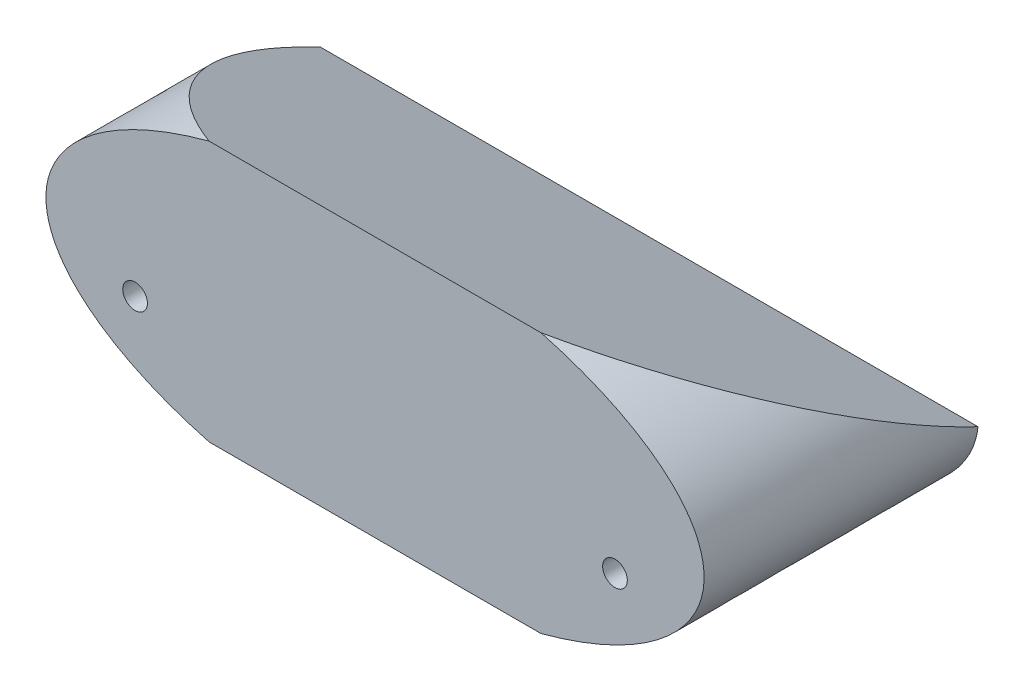
ISO-10303-21;
HEADER;
FILE_DESCRIPTION(('STEP AP214'),'2;1');
FILE_NAME('part.step','',(''),(''),'','','');
FILE_SCHEMA(('AUTOMOTIVE_DESIGN { 1 0 10303 214 1 1 1 1 }'));
ENDSEC;
DATA;
#1=APPLICATION_CONTEXT('core data for automotive mechanical design processes');
#2=APPLICATION_PROTOCOL_DEFINITION('international standard','automotive_design',2000,#1);
#3=PRODUCT_CONTEXT('',#1,'mechanical');
#4=PRODUCT('Part','Part','',(#3));
#5=PRODUCT_RELATED_PRODUCT_CATEGORY('part','',(#4));
#6=PRODUCT_DEFINITION_FORMATION('','',#4);
#7=PRODUCT_DEFINITION_CONTEXT('part definition',#1,'design');
#8=PRODUCT_DEFINITION('design','',#6,#7);
#9=PRODUCT_DEFINITION_SHAPE('','',#8);
#10=(LENGTH_UNIT() NAMED_UNIT(*) SI_UNIT(.MILLI.,.METRE.));
#11=(NAMED_UNIT(*) PLANE_ANGLE_UNIT() SI_UNIT($,.RADIAN.));
#12=(NAMED_UNIT(*) SI_UNIT($,.STERADIAN.) SOLID_ANGLE_UNIT());
#13=UNCERTAINTY_MEASURE_WITH_UNIT(LENGTH_MEASURE(1.E-05),#10,'distance_accuracy_value','');
#14=(GEOMETRIC_REPRESENTATION_CONTEXT(3) GLOBAL_UNCERTAINTY_ASSIGNED_CONTEXT((#13)) GLOBAL_UNIT_ASSIGNED_CONTEXT((#10,
#11,#12)) REPRESENTATION_CONTEXT('',''));
#15=CARTESIAN_POINT('',(0.,0.,0.));
#16=DIRECTION('',(0.,0.,1.));
#17=DIRECTION('',(1.,0.,0.));
#18=AXIS2_PLACEMENT_3D('',#15,#16,#17);
#19=CARTESIAN_POINT('',(0.,0.,-200.));
#20=DIRECTION('',(0.,0.,1.));
#21=DIRECTION('',(1.,0.,0.));
#22=AXIS2_PLACEMENT_3D('',#19,#20,#21);
#23=ELLIPSE('',#22,240.,110.);
#24=DIRECTION('',(0.,0.,1.));
#25=VECTOR('',#24,1.);
#26=SURFACE_OF_LINEAR_EXTRUSION('',#23,#25);
#27=CARTESIAN_POINT('',(120.987670979012,95.,0.));
#28=CARTESIAN_POINT('',(123.852817341299,94.2334973296872,-1.53300534062563));
#29=CARTESIAN_POINT('',(126.681937199954,93.44008095123,-3.11983809754002));
#30=CARTESIAN_POINT('',(132.263458027457,91.8010398679318,-6.39792026413629));
#31=CARTESIAN_POINT('',(135.015860274819,90.9554160338947,-8.08916793221053));
#32=CARTESIAN_POINT('',(140.438956988144,89.2136879872277,-11.5726240255446));
#33=CARTESIAN_POINT('',(143.109664009403,88.3175915922093,-13.3648168155815));
#34=CARTESIAN_POINT('',(148.36544207333,86.476502384894,-17.0469952302121));
#35=CARTESIAN_POINT('',(150.95051286633,85.5315094300616,-18.9369811398768));
#36=CARTESIAN_POINT('',(156.030708489069,83.5944406060402,-22.8111187879195));
#37=CARTESIAN_POINT('',(158.525836905665,82.6023666180824,-24.7952667638353));
#38=CARTESIAN_POINT('',(163.422261711521,80.5729397873519,-28.8541204252963));
#39=CARTESIAN_POINT('',(165.823557900466,79.5355868479269,-30.9288263041462));
#40=CARTESIAN_POINT('',(170.528553713173,77.4174874521818,-35.1650250956365));
#41=CARTESIAN_POINT('',(172.832251558762,76.336740205946,-37.326519588108));
#42=CARTESIAN_POINT('',(177.338403547323,74.1338294790929,-41.7323410418142));
#43=CARTESIAN_POINT('',(179.540857691877,73.0116659991228,-43.9766680017544));
#44=CARTESIAN_POINT('',(183.840882452469,70.7280620306475,-48.543875938705));
#45=CARTESIAN_POINT('',(185.93846479938,69.5666259596152,-50.8667480807697));
#46=CARTESIAN_POINT('',(190.025815415386,67.2064148344133,-55.5871703311735));
#47=CARTESIAN_POINT('',(192.015583676401,66.0076397774456,-57.9847204451089));
#48=CARTESIAN_POINT('',(195.884296149006,63.5748606955187,-62.8502786089626));
#49=CARTESIAN_POINT('',(197.763241303239,62.3408569703412,-65.3182860593177));
#50=CARTESIAN_POINT('',(201.407533555128,59.8397484217815,-70.320503156437));
#51=CARTESIAN_POINT('',(203.172880670927,58.5726436036861,-72.8547127926278));
#52=CARTESIAN_POINT('',(206.587207528562,56.0076372979447,-77.9847254041106));
#53=CARTESIAN_POINT('',(208.236199344245,54.7097390243761,-80.5805219512479));
#54=CARTESIAN_POINT('',(211.415624985766,52.0852188738917,-85.8295622522167));
#55=CARTESIAN_POINT('',(212.946058743123,50.7585969803851,-88.4828060392298));
#56=CARTESIAN_POINT('',(215.886212437792,48.0788192019099,-93.8423615961802));
#57=CARTESIAN_POINT('',(217.295928924527,46.7256625598308,-96.5486748803384));
#58=CARTESIAN_POINT('',(219.992593458646,43.9951061026443,-102.009787794711));
#59=CARTESIAN_POINT('',(221.279541770631,42.6177063397953,-104.764587320409));
#60=CARTESIAN_POINT('',(223.728829961913,39.8409684915181,-110.318063016964));
#61=CARTESIAN_POINT('',(224.891173233514,38.4416310045219,-113.116737990956));
#62=CARTESIAN_POINT('',(227.089673128854,35.6232694149857,-118.753461170029));
#63=CARTESIAN_POINT('',(228.125829331635,34.2042452467887,-121.591509506423));
#64=CARTESIAN_POINT('',(230.070420542019,31.3489534213173,-127.302093157365));
#65=CARTESIAN_POINT('',(230.978869128298,29.9126876149344,-130.174624770131));
#66=CARTESIAN_POINT('',(232.66688020902,27.0251884004725,-135.949623199055));
#67=CARTESIAN_POINT('',(233.44644673183,25.5739554617162,-138.852089076568));
#68=CARTESIAN_POINT('',(235.320664864124,21.7510626452714,-146.497874709457));
#69=CARTESIAN_POINT('',(236.309329565317,19.3688535652066,-151.262292869587));
#70=CARTESIAN_POINT('',(237.940854467422,14.5811279335061,-160.837744132988));
#71=CARTESIAN_POINT('',(238.58375644472,12.1756142333943,-165.648771533211));
#72=CARTESIAN_POINT('',(239.291244191713,8.53687972951115,-172.926240540978));
#73=CARTESIAN_POINT('',(239.484772129519,7.30842591882959,-175.383148162341));
#74=CARTESIAN_POINT('',(239.781724271749,4.84929601416497,-180.30140797167));
#75=CARTESIAN_POINT('',(239.885148435565,3.61861991918062,-182.762760161639));
#76=CARTESIAN_POINT('',(240.001784023898,1.15623803253441,-187.687523934931));
#77=CARTESIAN_POINT('',(240.014981785264,-0.0754678868327284,-190.150935773665));
#78=CARTESIAN_POINT('',(239.951137496914,-2.53841242574705,-195.076824851494));
#79=CARTESIAN_POINT('',(239.874095403306,-3.76965104506667,-197.539302090133));
#80=CARTESIAN_POINT('',(239.75193791821,-4.99999999999999,-200.));
#81=B_SPLINE_CURVE_WITH_KNOTS('',3,(#27,#28,#29,#30,#31,#32,#33,#34,#35,#36,#37,#38,#39,#40,#41,
#42,#43,#44,#45,#46,#47,#48,#49,#50,#51,#52,#53,#54,#55,#56,#57,#58,#59,#60,#61,#62,#63,#64,#65,
#66,#67,#68,#69,#70,#71,#72,#73,#74,#75,#76,#77,#78,#79,#80),.UNSPECIFIED.,.F.,.F.,(4,2,2,2,2,2,
2,2,2,2,2,2,2,2,2,2,2,2,2,2,2,2,2,2,2,2,4),(0.,10.0152333105611,20.0302996153102,
30.0438189460647,40.0573674682884,50.0705162124455,60.0836863316902,70.097038805467,
80.1103911227566,90.1226208371933,100.134851301942,110.146996592063,120.159140283101,
130.170243511022,140.181352521533,150.192747593793,160.204121088172,170.215221959115,
180.226356226034,190.236425239997,200.246181317861,216.487628600071,232.727113086779,
240.987021751188,249.246934138245,257.508097311318,265.7692645025),.UNSPECIFIED.);
#82=CARTESIAN_POINT('',(120.987670979012,95.,0.));
#83=VERTEX_POINT('',#82);
#84=CARTESIAN_POINT('',(239.75193791821,-4.99999999999998,-200.));
#85=VERTEX_POINT('',#84);
#86=EDGE_CURVE('E88',#83,#85,#81,.T.);
#87=ORIENTED_EDGE('',*,*,#86,.F.);
#88=CARTESIAN_POINT('',(0.,0.,0.));
#89=DIRECTION('',(0.,0.,1.));
#90=DIRECTION('',(1.,0.,0.));
#91=AXIS2_PLACEMENT_3D('',#88,#89,#90);
#92=ELLIPSE('',#91,240.,110.);
#93=CARTESIAN_POINT('',(120.987670979012,-95.,0.));
#94=VERTEX_POINT('',#93);
#95=EDGE_CURVE('E93',#94,#83,#92,.T.);
#96=ORIENTED_EDGE('',*,*,#95,.F.);
#97=DIRECTION('',(0.,0.,1.));
#98=VECTOR('',#97,1.);
#99=CARTESIAN_POINT('',(120.987670979012,-95.,-200.));
#100=LINE('',#99,#98);
#101=CARTESIAN_POINT('',(120.987670979012,-95.,-200.));
#102=VERTEX_POINT('',#101);
#103=EDGE_CURVE('E52',#102,#94,#100,.T.);
#104=ORIENTED_EDGE('',*,*,#103,.F.);
#105=EDGE_CURVE('E92',#102,#85,#23,.T.);
#106=ORIENTED_EDGE('',*,*,#105,.T.);
#107=EDGE_LOOP('',(#87,#96,#104,#106));
#108=FACE_BOUND('',#107,.T.);
#109=ADVANCED_FACE('F35',(#108),#26,.T.);
#110=CARTESIAN_POINT('',(-239.75193791821,-4.99999999999999,-200.));
#111=CARTESIAN_POINT('',(-239.906818713967,-3.44028404738263,-196.880568094765));
#112=CARTESIAN_POINT('',(-239.989164200296,-1.87912925172746,-193.758258503455));
#113=CARTESIAN_POINT('',(-240.008831501693,1.24336258400876,-187.513274831983));
#114=CARTESIAN_POINT('',(-239.946153376438,2.80469962401454,-184.390600751971));
#115=CARTESIAN_POINT('',(-239.675820941811,5.92485703770843,-178.150285924583));
#116=CARTESIAN_POINT('',(-239.468167074517,7.48367741905611,-175.032645161888));
#117=CARTESIAN_POINT('',(-238.908200540393,10.5961110111393,-168.807777977722));
#118=CARTESIAN_POINT('',(-238.555888117793,12.1497242306616,-165.700551538677));
#119=CARTESIAN_POINT('',(-237.708298629177,15.2447502560893,-159.510499487822));
#120=CARTESIAN_POINT('',(-237.213421452437,16.7861849654287,-156.427630069143));
#121=CARTESIAN_POINT('',(-236.081050243962,19.8585411988784,-150.282917602243));
#122=CARTESIAN_POINT('',(-235.443556360155,21.3894627338916,-147.221074532217));
#123=CARTESIAN_POINT('',(-234.026908978837,24.4381002191928,-141.123799561614));
#124=CARTESIAN_POINT('',(-233.2477591442,25.9558165098729,-138.088366980254));
#125=CARTESIAN_POINT('',(-231.548943754175,28.975438222227,-132.049123555546));
#126=CARTESIAN_POINT('',(-230.629278408215,30.4773436674624,-129.045312665075));
#127=CARTESIAN_POINT('',(-228.657470904571,33.4526524192131,-123.094695161574));
#128=CARTESIAN_POINT('',(-227.606263190269,34.9261795891564,-120.147640821687));
#129=CARTESIAN_POINT('',(-225.368131116112,37.8524751631866,-114.295049673627));
#130=CARTESIAN_POINT('',(-224.181206856399,39.3052435825901,-111.38951283482));
#131=CARTESIAN_POINT('',(-221.673396472472,42.1874963328963,-105.625007334207));
#132=CARTESIAN_POINT('',(-220.352508243656,43.6169802975855,-102.766039404829));
#133=CARTESIAN_POINT('',(-217.578778726826,46.4501121230904,-97.0997757538191));
#134=CARTESIAN_POINT('',(-216.125937612966,47.8537600180025,-94.2924799639949));
#135=CARTESIAN_POINT('',(-213.105192191046,50.6192801442487,-88.7614397115025));
#136=CARTESIAN_POINT('',(-211.538535987286,51.981425050733,-86.0371498985341));
#137=CARTESIAN_POINT('',(-208.280351594354,54.6755105177227,-80.6489789645547));
#138=CARTESIAN_POINT('',(-206.588823728876,56.0074511565122,-77.9850976869756));
#139=CARTESIAN_POINT('',(-203.083573998529,58.6386809632882,-72.7226380734236));
#140=CARTESIAN_POINT('',(-201.269858779987,59.9379719019703,-70.1240561960594));
#141=CARTESIAN_POINT('',(-197.522959821456,62.5016307518714,-64.9967384962572));
#142=CARTESIAN_POINT('',(-195.589776466261,63.7659987755541,-62.4680024488918));
#143=CARTESIAN_POINT('',(-191.629950752605,66.2431288952505,-57.513742209499));
#144=CARTESIAN_POINT('',(-189.604644391632,67.4563181515172,-55.0873636969657));
#145=CARTESIAN_POINT('',(-185.443438483417,69.8441127734986,-50.3117744530028));
#146=CARTESIAN_POINT('',(-183.307541404712,71.0187189994847,-47.9625620010305));
#147=CARTESIAN_POINT('',(-178.928257606155,73.3273419272835,-43.3453161454329));
#148=CARTESIAN_POINT('',(-176.684860695187,74.4613547629189,-41.0772904741623));
#149=CARTESIAN_POINT('',(-172.094141782853,76.686671577077,-36.626656845846));
#150=CARTESIAN_POINT('',(-169.746811669089,77.7779722091737,-34.4440555816526));
#151=CARTESIAN_POINT('',(-165.033579396397,79.8794360110392,-30.2411279779217));
#152=CARTESIAN_POINT('',(-162.671012917519,80.8910959468049,-28.2178081063902));
#153=CARTESIAN_POINT('',(-157.855854982848,82.8709146469786,-24.2581707060428));
#154=CARTESIAN_POINT('',(-155.403251869983,83.8390677421951,-22.3218645156099));
#155=CARTESIAN_POINT('',(-150.41195364414,85.7300567102872,-18.5398865794256));
#156=CARTESIAN_POINT('',(-147.873253635945,86.6528899990837,-16.6942200018327));
#157=CARTESIAN_POINT('',(-142.709815290295,88.4529266683066,-13.0941466633867));
#158=CARTESIAN_POINT('',(-140.084948449849,89.3300563336763,-11.3398873326474));
#159=CARTESIAN_POINT('',(-134.757229728069,91.0354821714236,-7.92903565715278));
#160=CARTESIAN_POINT('',(-132.054381374478,91.8637805476975,-6.27243890460498));
#161=CARTESIAN_POINT('',(-126.575134858325,93.4700191633629,-3.05996167327425));
#162=CARTESIAN_POINT('',(-123.798741568965,94.2479627276382,-1.50407454472368));
#163=CARTESIAN_POINT('',(-120.987670979012,95.,0.));
#164=B_SPLINE_CURVE_WITH_KNOTS('',3,(#110,#111,#112,#113,#114,#115,#116,#117,#118,#119,#120,
#121,#122,#123,#124,#125,#126,#127,#128,#129,#130,#131,#132,#133,#134,#135,#136,#137,#138,#139,
#140,#141,#142,#143,#144,#145,#146,#147,#148,#149,#150,#151,#152,#153,#154,#155,#156,#157,#158,
#159,#160,#161,#162,#163),.UNSPECIFIED.,.F.,.F.,(4,2,2,2,2,2,2,2,2,2,2,2,2,2,2,2,2,2,2,2,2,2,2,
2,2,2,4),(0.,10.4724465158912,20.9448887224109,31.4172989952563,41.8896915874237,
52.3329908178872,62.7762792162448,73.2192976153211,83.6623004500058,94.0349339180321,
104.407559732399,114.780348528228,125.153123633929,135.42562373802,145.698097214589,
155.970012375078,166.241894452628,176.395236372327,186.548351752913,196.702431572926,
206.857305361194,216.667442837407,226.478854946062,236.290825841292,246.118161373861,
255.945053030467,265.771295162787),.UNSPECIFIED.);
#165=CARTESIAN_POINT('',(-239.75193791821,-4.99999999999998,-200.));
#166=VERTEX_POINT('',#165);
#167=CARTESIAN_POINT('',(-120.987670979012,95.,0.));
#168=VERTEX_POINT('',#167);
#169=EDGE_CURVE('E59',#166,#168,#164,.T.);
#170=ORIENTED_EDGE('',*,*,#169,.F.);
#171=CARTESIAN_POINT('',(-120.987670979012,-95.,-200.));
#172=VERTEX_POINT('',#171);
#173=EDGE_CURVE('E82',#166,#172,#23,.T.);
#174=ORIENTED_EDGE('',*,*,#173,.T.);
#175=DIRECTION('',(0.,0.,1.));
#176=VECTOR('',#175,1.);
#177=CARTESIAN_POINT('',(-120.987670979012,-95.,-200.));
#178=LINE('',#177,#176);
#179=CARTESIAN_POINT('',(-120.987670979012,-95.,0.));
#180=VERTEX_POINT('',#179);
#181=EDGE_CURVE('E76',#180,#172,#178,.F.);
#182=ORIENTED_EDGE('',*,*,#181,.F.);
#183=EDGE_CURVE('E86',#168,#180,#92,.T.);
#184=ORIENTED_EDGE('',*,*,#183,.F.);
#185=EDGE_LOOP('',(#170,#174,#182,#184));
#186=FACE_BOUND('',#185,.T.);
#187=ADVANCED_FACE('F37',(#186),#26,.T.);
#188=CARTESIAN_POINT('',(0.,0.,-200.));
#189=DIRECTION('',(0.,0.,1.));
#190=DIRECTION('',(1.,0.,0.));
#191=AXIS2_PLACEMENT_3D('',#188,#189,#190);
#192=PLANE('',#191);
#193=CARTESIAN_POINT('',(175.,-30.,-200.));
#194=DIRECTION('',(0.,0.,1.));
#195=DIRECTION('',(1.,0.,0.));
#196=AXIS2_PLACEMENT_3D('',#193,#194,#195);
#197=CIRCLE('',#196,9.00000000000001);
#198=CARTESIAN_POINT('',(184.,-30.,-200.));
#199=VERTEX_POINT('',#198);
#200=EDGE_CURVE('E96',#199,#199,#197,.T.);
#201=ORIENTED_EDGE('',*,*,#200,.T.);
#202=EDGE_LOOP('',(#201));
#203=FACE_BOUND('',#202,.T.);
#204=CARTESIAN_POINT('',(-175.,-30.,-200.));
#205=DIRECTION('',(0.,0.,1.));
#206=DIRECTION('',(-1.,0.,0.));
#207=AXIS2_PLACEMENT_3D('',#204,#205,#206);
#208=CIRCLE('',#207,9.00000000000001);
#209=CARTESIAN_POINT('',(-184.,-30.,-200.));
#210=VERTEX_POINT('',#209);
#211=EDGE_CURVE('E102',#210,#210,#208,.T.);
#212=ORIENTED_EDGE('',*,*,#211,.T.);
#213=EDGE_LOOP('',(#212));
#214=FACE_BOUND('',#213,.T.);
#215=ORIENTED_EDGE('',*,*,#173,.F.);
#216=DIRECTION('',(1.,0.,0.));
#217=VECTOR('',#216,1.);
#218=CARTESIAN_POINT('',(-240.,-4.99999999999998,-200.));
#219=LINE('',#218,#217);
#220=EDGE_CURVE('E147',#166,#85,#219,.T.);
#221=ORIENTED_EDGE('',*,*,#220,.T.);
#222=ORIENTED_EDGE('',*,*,#105,.F.);
#223=DIRECTION('',(1.,0.,0.));
#224=VECTOR('',#223,1.);
#225=CARTESIAN_POINT('',(-240.,-95.,-200.));
#226=LINE('',#225,#224);
#227=EDGE_CURVE('E149',#172,#102,#226,.T.);
#228=ORIENTED_EDGE('',*,*,#227,.F.);
#229=EDGE_LOOP('',(#215,#221,#222,#228));
#230=FACE_BOUND('',#229,.T.);
#231=ADVANCED_FACE('F133',(#203,#214,#230),#192,.F.);
#232=CARTESIAN_POINT('',(0.,0.,0.));
#233=DIRECTION('',(0.,0.,1.));
#234=DIRECTION('',(1.,0.,0.));
#235=AXIS2_PLACEMENT_3D('',#232,#233,#234);
#236=PLANE('',#235);
#237=DIRECTION('',(1.,0.,0.));
#238=VECTOR('',#237,1.);
#239=CARTESIAN_POINT('',(0.,95.,0.));
#240=LINE('',#239,#238);
#241=EDGE_CURVE('E11',#168,#83,#240,.T.);
#242=ORIENTED_EDGE('',*,*,#241,.F.);
#243=ORIENTED_EDGE('',*,*,#183,.T.);
#244=DIRECTION('',(-1.,0.,0.));
#245=VECTOR('',#244,1.);
#246=CARTESIAN_POINT('',(0.,-95.,0.));
#247=LINE('',#246,#245);
#248=EDGE_CURVE('E45',#94,#180,#247,.T.);
#249=ORIENTED_EDGE('',*,*,#248,.F.);
#250=ORIENTED_EDGE('',*,*,#95,.T.);
#251=EDGE_LOOP('',(#242,#243,#249,#250));
#252=FACE_BOUND('',#251,.T.);
#253=CARTESIAN_POINT('',(175.,-30.,0.));
#254=DIRECTION('',(0.,0.,1.));
#255=DIRECTION('',(1.,0.,0.));
#256=AXIS2_PLACEMENT_3D('',#253,#254,#255);
#257=CIRCLE('',#256,9.00000000000001);
#258=CARTESIAN_POINT('',(184.,-30.,0.));
#259=VERTEX_POINT('',#258);
#260=EDGE_CURVE('E105',#259,#259,#257,.T.);
#261=ORIENTED_EDGE('',*,*,#260,.F.);
#262=EDGE_LOOP('',(#261));
#263=FACE_BOUND('',#262,.T.);
#264=CARTESIAN_POINT('',(-175.,-30.,0.));
#265=DIRECTION('',(0.,0.,1.));
#266=DIRECTION('',(-1.,0.,0.));
#267=AXIS2_PLACEMENT_3D('',#264,#265,#266);
#268=CIRCLE('',#267,9.00000000000001);
#269=CARTESIAN_POINT('',(-184.,-30.,0.));
#270=VERTEX_POINT('',#269);
#271=EDGE_CURVE('E99',#270,#270,#268,.T.);
#272=ORIENTED_EDGE('',*,*,#271,.F.);
#273=EDGE_LOOP('',(#272));
#274=FACE_BOUND('',#273,.T.);
#275=ADVANCED_FACE('F90',(#252,#263,#274),#236,.T.);
#276=CARTESIAN_POINT('',(-175.,-30.,-200.));
#277=DIRECTION('',(0.,0.,1.));
#278=DIRECTION('',(1.,0.,0.));
#279=AXIS2_PLACEMENT_3D('',#276,#277,#278);
#280=CYLINDRICAL_SURFACE('',#279,9.00000000000001);
#281=ORIENTED_EDGE('',*,*,#211,.F.);
#282=EDGE_LOOP('',(#281));
#283=FACE_BOUND('',#282,.T.);
#284=ORIENTED_EDGE('',*,*,#271,.T.);
#285=EDGE_LOOP('',(#284));
#286=FACE_BOUND('',#285,.T.);
#287=ADVANCED_FACE('F128',(#283,#286),#280,.F.);
#288=CARTESIAN_POINT('',(175.,-30.,-200.));
#289=DIRECTION('',(0.,0.,1.));
#290=DIRECTION('',(1.,0.,0.));
#291=AXIS2_PLACEMENT_3D('',#288,#289,#290);
#292=CYLINDRICAL_SURFACE('',#291,9.00000000000001);
#293=ORIENTED_EDGE('',*,*,#200,.F.);
#294=EDGE_LOOP('',(#293));
#295=FACE_BOUND('',#294,.T.);
#296=ORIENTED_EDGE('',*,*,#260,.T.);
#297=EDGE_LOOP('',(#296));
#298=FACE_BOUND('',#297,.T.);
#299=ADVANCED_FACE('F125',(#295,#298),#292,.F.);
#300=CARTESIAN_POINT('',(-240.,-95.,-200.));
#301=DIRECTION('',(0.,1.,0.));
#302=DIRECTION('',(0.,0.,1.));
#303=AXIS2_PLACEMENT_3D('',#300,#301,#302);
#304=PLANE('',#303);
#305=ORIENTED_EDGE('',*,*,#181,.T.);
#306=ORIENTED_EDGE('',*,*,#227,.T.);
#307=ORIENTED_EDGE('',*,*,#103,.T.);
#308=ORIENTED_EDGE('',*,*,#248,.T.);
#309=EDGE_LOOP('',(#305,#306,#307,#308));
#310=FACE_BOUND('',#309,.T.);
#311=ADVANCED_FACE('F75',(#310),#304,.F.);
#312=CARTESIAN_POINT('',(-240.,95.,0.));
#313=DIRECTION('',(0.,-0.894427190999916,0.447213595499958));
#314=DIRECTION('',(0.,-0.447213595499958,-0.894427190999916));
#315=AXIS2_PLACEMENT_3D('',#312,#313,#314);
#316=PLANE('',#315);
#317=ORIENTED_EDGE('',*,*,#169,.T.);
#318=ORIENTED_EDGE('',*,*,#241,.T.);
#319=ORIENTED_EDGE('',*,*,#86,.T.);
#320=ORIENTED_EDGE('',*,*,#220,.F.);
#321=EDGE_LOOP('',(#317,#318,#319,#320));
#322=FACE_BOUND('',#321,.T.);
#323=ADVANCED_FACE('F118',(#322),#316,.F.);
#324=CLOSED_SHELL('',(#109,#187,#231,#275,#287,#299,#311,#323));
#325=MANIFOLD_SOLID_BREP('B2',#324);
#326=ADVANCED_BREP_SHAPE_REPRESENTATION('',(#18,#325),#14);
#327=SHAPE_DEFINITION_REPRESENTATION(#9,#326);
ENDSEC;
END-ISO-10303-21;
